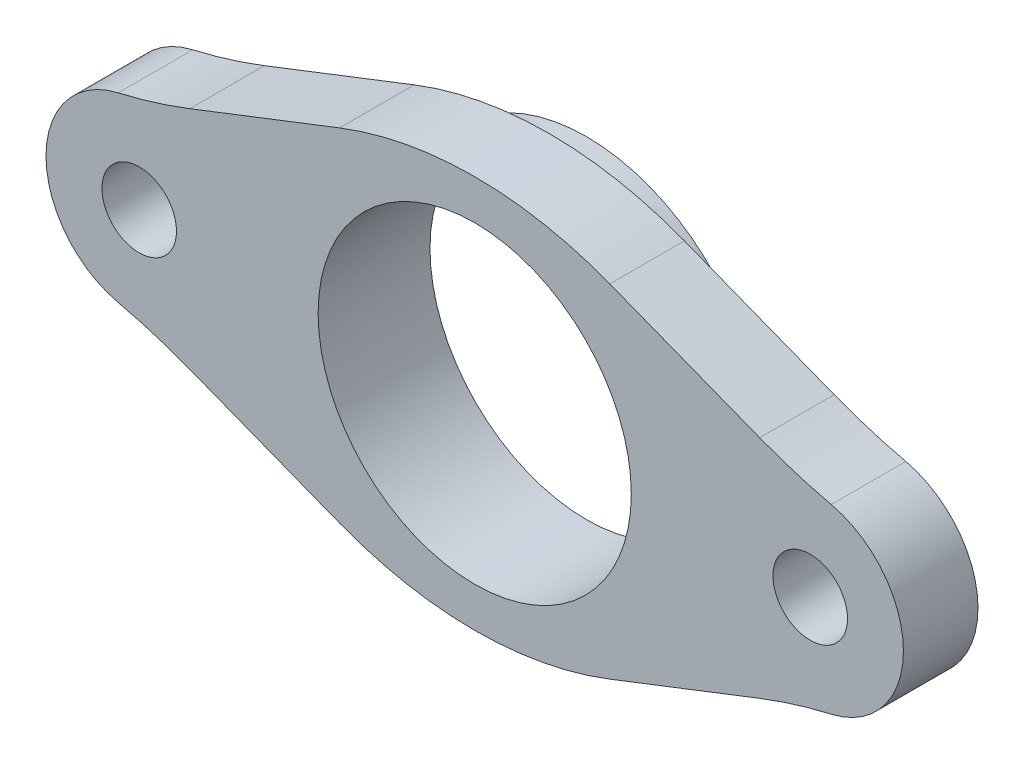
ISO-10303-21;
HEADER;
FILE_DESCRIPTION(('STEP AP214'),'2;1');
FILE_NAME('part.step','',(''),(''),'','','');
FILE_SCHEMA(('AUTOMOTIVE_DESIGN { 1 0 10303 214 1 1 1 1 }'));
ENDSEC;
DATA;
#1=APPLICATION_CONTEXT('core data for automotive mechanical design processes');
#2=APPLICATION_PROTOCOL_DEFINITION('international standard','automotive_design',2000,#1);
#3=PRODUCT_CONTEXT('',#1,'mechanical');
#4=PRODUCT('Part','Part','',(#3));
#5=PRODUCT_RELATED_PRODUCT_CATEGORY('part','',(#4));
#6=PRODUCT_DEFINITION_FORMATION('','',#4);
#7=PRODUCT_DEFINITION_CONTEXT('part definition',#1,'design');
#8=PRODUCT_DEFINITION('design','',#6,#7);
#9=PRODUCT_DEFINITION_SHAPE('','',#8);
#10=(LENGTH_UNIT() NAMED_UNIT(*) SI_UNIT(.MILLI.,.METRE.));
#11=(NAMED_UNIT(*) PLANE_ANGLE_UNIT() SI_UNIT($,.RADIAN.));
#12=(NAMED_UNIT(*) SI_UNIT($,.STERADIAN.) SOLID_ANGLE_UNIT());
#13=UNCERTAINTY_MEASURE_WITH_UNIT(LENGTH_MEASURE(1.E-05),#10,'distance_accuracy_value','');
#14=(GEOMETRIC_REPRESENTATION_CONTEXT(3) GLOBAL_UNCERTAINTY_ASSIGNED_CONTEXT((#13)) GLOBAL_UNIT_ASSIGNED_CONTEXT((#10,
#11,#12)) REPRESENTATION_CONTEXT('',''));
#15=CARTESIAN_POINT('',(0.,0.,0.));
#16=DIRECTION('',(0.,0.,1.));
#17=DIRECTION('',(1.,0.,0.));
#18=AXIS2_PLACEMENT_3D('',#15,#16,#17);
#19=CARTESIAN_POINT('',(-54.3653488949815,215.389389357285,10.));
#20=DIRECTION('',(0.,0.,1.));
#21=DIRECTION('',(1.,0.,0.));
#22=AXIS2_PLACEMENT_3D('',#19,#20,#21);
#23=PLANE('',#22);
#24=CARTESIAN_POINT('',(-54.3653488949814,215.389389357285,10.));
#25=DIRECTION('',(0.,0.,1.));
#26=DIRECTION('',(1.,0.,0.));
#27=AXIS2_PLACEMENT_3D('',#24,#25,#26);
#28=CIRCLE('',#27,5.);
#29=CARTESIAN_POINT('',(-49.3653488949814,215.389389357285,10.));
#30=VERTEX_POINT('',#29);
#31=EDGE_CURVE('E241',#30,#30,#28,.T.);
#32=ORIENTED_EDGE('',*,*,#31,.F.);
#33=EDGE_LOOP('',(#32));
#34=FACE_BOUND('',#33,.T.);
#35=CARTESIAN_POINT('',(-144.365348894981,215.389389357285,10.));
#36=DIRECTION('',(0.,0.,1.));
#37=DIRECTION('',(1.,0.,0.));
#38=AXIS2_PLACEMENT_3D('',#35,#36,#37);
#39=CIRCLE('',#38,12.5);
#40=CARTESIAN_POINT('',(-147.181311053472,227.568073897167,10.));
#41=VERTEX_POINT('',#40);
#42=CARTESIAN_POINT('',(-147.181311053472,203.210704817404,10.));
#43=VERTEX_POINT('',#42);
#44=EDGE_CURVE('E211',#41,#43,#39,.T.);
#45=ORIENTED_EDGE('',*,*,#44,.T.);
#46=CARTESIAN_POINT('',(-162.950699141017,135.010071394067,10.));
#47=DIRECTION('',(0.,0.,1.));
#48=DIRECTION('',(1.,0.,0.));
#49=AXIS2_PLACEMENT_3D('',#46,#47,#48);
#50=CIRCLE('',#49,70.);
#51=CARTESIAN_POINT('',(-137.57917277496,200.250286368088,10.));
#52=VERTEX_POINT('',#51);
#53=EDGE_CURVE('E11',#43,#52,#50,.F.);
#54=ORIENTED_EDGE('',*,*,#53,.T.);
#55=DIRECTION('',(0.932003071057442,-0.362450376657961,0.));
#56=VECTOR('',#55,1.);
#57=CARTESIAN_POINT('',(-99.3659371302731,185.389389357285,10.));
#58=LINE('',#57,#56);
#59=CARTESIAN_POINT('',(-117.488219070191,192.437035571125,10.));
#60=VERTEX_POINT('',#59);
#61=EDGE_CURVE('E210',#52,#60,#58,.T.);
#62=ORIENTED_EDGE('',*,*,#61,.T.);
#63=CARTESIAN_POINT('',(-99.3657002372929,239.037189123997,10.));
#64=DIRECTION('',(0.,0.,1.));
#65=DIRECTION('',(1.,0.,0.));
#66=AXIS2_PLACEMENT_3D('',#63,#64,#65);
#67=CIRCLE('',#66,50.);
#68=CARTESIAN_POINT('',(-81.2435929503765,192.436875525466,10.));
#69=VERTEX_POINT('',#68);
#70=EDGE_CURVE('E163',#60,#69,#67,.T.);
#71=ORIENTED_EDGE('',*,*,#70,.T.);
#72=DIRECTION('',(0.932006271970632,0.362442145738328,0.));
#73=VECTOR('',#72,1.);
#74=CARTESIAN_POINT('',(-54.3653488949815,202.889389357285,10.));
#75=LINE('',#74,#73);
#76=CARTESIAN_POINT('',(-61.1513864356016,200.250409254627,10.));
#77=VERTEX_POINT('',#76);
#78=EDGE_CURVE('E142',#69,#77,#75,.T.);
#79=ORIENTED_EDGE('',*,*,#78,.T.);
#80=CARTESIAN_POINT('',(-35.7804362339186,135.009970216683,10.));
#81=DIRECTION('',(0.,0.,1.));
#82=DIRECTION('',(1.,0.,0.));
#83=AXIS2_PLACEMENT_3D('',#80,#81,#82);
#84=CIRCLE('',#83,70.);
#85=CARTESIAN_POINT('',(-51.5494530372447,203.210689487497,10.));
#86=VERTEX_POINT('',#85);
#87=EDGE_CURVE('E191',#77,#86,#84,.F.);
#88=ORIENTED_EDGE('',*,*,#87,.T.);
#89=CARTESIAN_POINT('',(-54.3653488949815,215.389389357285,10.));
#90=DIRECTION('',(0.,0.,1.));
#91=DIRECTION('',(1.,0.,0.));
#92=AXIS2_PLACEMENT_3D('',#89,#90,#91);
#93=CIRCLE('',#92,12.5);
#94=CARTESIAN_POINT('',(-51.5494530372447,227.568089227074,10.));
#95=VERTEX_POINT('',#94);
#96=EDGE_CURVE('E148',#86,#95,#93,.T.);
#97=ORIENTED_EDGE('',*,*,#96,.T.);
#98=CARTESIAN_POINT('',(-35.7804362339186,295.768808497888,10.));
#99=DIRECTION('',(0.,0.,1.));
#100=DIRECTION('',(1.,0.,0.));
#101=AXIS2_PLACEMENT_3D('',#98,#99,#100);
#102=CIRCLE('',#101,70.);
#103=CARTESIAN_POINT('',(-61.1513864356016,230.528369459944,10.));
#104=VERTEX_POINT('',#103);
#105=EDGE_CURVE('E195',#95,#104,#102,.F.);
#106=ORIENTED_EDGE('',*,*,#105,.T.);
#107=DIRECTION('',(-0.932006271970632,0.362442145738328,0.));
#108=VECTOR('',#107,1.);
#109=CARTESIAN_POINT('',(-54.3653488949815,227.889389357285,10.));
#110=LINE('',#109,#108);
#111=CARTESIAN_POINT('',(-81.2435929503765,238.341903189105,10.));
#112=VERTEX_POINT('',#111);
#113=EDGE_CURVE('E152',#104,#112,#110,.T.);
#114=ORIENTED_EDGE('',*,*,#113,.T.);
#115=CARTESIAN_POINT('',(-99.3657002372929,191.741589590574,10.));
#116=DIRECTION('',(0.,0.,1.));
#117=DIRECTION('',(1.,0.,0.));
#118=AXIS2_PLACEMENT_3D('',#115,#116,#117);
#119=CIRCLE('',#118,50.);
#120=CARTESIAN_POINT('',(-117.488219070191,238.341743143446,10.));
#121=VERTEX_POINT('',#120);
#122=EDGE_CURVE('E161',#112,#121,#119,.T.);
#123=ORIENTED_EDGE('',*,*,#122,.T.);
#124=DIRECTION('',(-0.932003071057441,-0.362450376657962,0.));
#125=VECTOR('',#124,1.);
#126=CARTESIAN_POINT('',(-99.3659371302731,245.389389357285,10.));
#127=LINE('',#126,#125);
#128=CARTESIAN_POINT('',(-137.57917277496,230.528492346483,10.));
#129=VERTEX_POINT('',#128);
#130=EDGE_CURVE('E214',#121,#129,#127,.T.);
#131=ORIENTED_EDGE('',*,*,#130,.T.);
#132=CARTESIAN_POINT('',(-162.950699141018,295.768707320504,10.));
#133=DIRECTION('',(0.,0.,1.));
#134=DIRECTION('',(1.,0.,0.));
#135=AXIS2_PLACEMENT_3D('',#132,#133,#134);
#136=CIRCLE('',#135,70.);
#137=EDGE_CURVE('E199',#129,#41,#136,.F.);
#138=ORIENTED_EDGE('',*,*,#137,.T.);
#139=EDGE_LOOP('',(#45,#54,#62,#71,#79,#88,#97,#106,#114,#123,#131,#138));
#140=FACE_BOUND('',#139,.T.);
#141=CARTESIAN_POINT('',(-144.365348894981,215.389389357285,10.));
#142=DIRECTION('',(0.,0.,1.));
#143=DIRECTION('',(1.,0.,0.));
#144=AXIS2_PLACEMENT_3D('',#141,#142,#143);
#145=CIRCLE('',#144,5.00000000000002);
#146=CARTESIAN_POINT('',(-139.365348894981,215.389389357285,10.));
#147=VERTEX_POINT('',#146);
#148=EDGE_CURVE('E245',#147,#147,#145,.T.);
#149=ORIENTED_EDGE('',*,*,#148,.F.);
#150=EDGE_LOOP('',(#149));
#151=FACE_BOUND('',#150,.T.);
#152=CARTESIAN_POINT('',(-99.3659371302731,215.389389357285,10.));
#153=DIRECTION('',(0.,0.,1.));
#154=DIRECTION('',(1.,0.,0.));
#155=AXIS2_PLACEMENT_3D('',#152,#153,#154);
#156=CIRCLE('',#155,21.);
#157=CARTESIAN_POINT('',(-78.3659371302731,215.389389357285,10.));
#158=VERTEX_POINT('',#157);
#159=EDGE_CURVE('E222',#158,#158,#156,.T.);
#160=ORIENTED_EDGE('',*,*,#159,.F.);
#161=EDGE_LOOP('',(#160));
#162=FACE_BOUND('',#161,.T.);
#163=ADVANCED_FACE('F33',(#34,#140,#151,#162),#23,.T.);
#164=CARTESIAN_POINT('',(-54.3653488949815,215.389389357285,0.));
#165=DIRECTION('',(0.,0.,1.));
#166=DIRECTION('',(1.,0.,0.));
#167=AXIS2_PLACEMENT_3D('',#164,#165,#166);
#168=PLANE('',#167);
#169=CARTESIAN_POINT('',(-99.3659371302731,215.389389357285,0.));
#170=DIRECTION('',(0.,0.,1.));
#171=DIRECTION('',(1.,0.,0.));
#172=AXIS2_PLACEMENT_3D('',#169,#170,#171);
#173=CIRCLE('',#172,23.5);
#174=CARTESIAN_POINT('',(-75.8659371302731,215.389389357285,0.));
#175=VERTEX_POINT('',#174);
#176=EDGE_CURVE('E37',#175,#175,#173,.T.);
#177=ORIENTED_EDGE('',*,*,#176,.T.);
#178=EDGE_LOOP('',(#177));
#179=FACE_BOUND('',#178,.T.);
#180=DIRECTION('',(0.932006271970632,0.362442145738328,0.));
#181=VECTOR('',#180,1.);
#182=CARTESIAN_POINT('',(-54.3653488949815,202.889389357285,0.));
#183=LINE('',#182,#181);
#184=CARTESIAN_POINT('',(-81.2435929503765,192.436875525466,0.));
#185=VERTEX_POINT('',#184);
#186=CARTESIAN_POINT('',(-61.1513864356016,200.250409254627,0.));
#187=VERTEX_POINT('',#186);
#188=EDGE_CURVE('E139',#185,#187,#183,.T.);
#189=ORIENTED_EDGE('',*,*,#188,.F.);
#190=CARTESIAN_POINT('',(-99.3657002372929,239.037189123997,0.));
#191=DIRECTION('',(0.,0.,1.));
#192=DIRECTION('',(1.,0.,0.));
#193=AXIS2_PLACEMENT_3D('',#190,#191,#192);
#194=CIRCLE('',#193,50.);
#195=CARTESIAN_POINT('',(-117.488219070191,192.437035571125,0.));
#196=VERTEX_POINT('',#195);
#197=EDGE_CURVE('E123',#185,#196,#194,.F.);
#198=ORIENTED_EDGE('',*,*,#197,.T.);
#199=DIRECTION('',(0.932003071057442,-0.362450376657961,0.));
#200=VECTOR('',#199,1.);
#201=CARTESIAN_POINT('',(-99.3659371302731,185.389389357285,0.));
#202=LINE('',#201,#200);
#203=CARTESIAN_POINT('',(-137.57917277496,200.250286368088,0.));
#204=VERTEX_POINT('',#203);
#205=EDGE_CURVE('E149',#204,#196,#202,.T.);
#206=ORIENTED_EDGE('',*,*,#205,.F.);
#207=CARTESIAN_POINT('',(-162.950699141017,135.010071394067,0.));
#208=DIRECTION('',(0.,0.,1.));
#209=DIRECTION('',(1.,0.,0.));
#210=AXIS2_PLACEMENT_3D('',#207,#208,#209);
#211=CIRCLE('',#210,70.);
#212=CARTESIAN_POINT('',(-147.181311053472,203.210704817404,0.));
#213=VERTEX_POINT('',#212);
#214=EDGE_CURVE('E42',#204,#213,#211,.T.);
#215=ORIENTED_EDGE('',*,*,#214,.T.);
#216=CARTESIAN_POINT('',(-144.365348894981,215.389389357285,0.));
#217=DIRECTION('',(0.,0.,1.));
#218=DIRECTION('',(1.,0.,0.));
#219=AXIS2_PLACEMENT_3D('',#216,#217,#218);
#220=CIRCLE('',#219,12.5);
#221=CARTESIAN_POINT('',(-147.181311053472,227.568073897167,0.));
#222=VERTEX_POINT('',#221);
#223=EDGE_CURVE('E154',#222,#213,#220,.T.);
#224=ORIENTED_EDGE('',*,*,#223,.F.);
#225=CARTESIAN_POINT('',(-162.950699141018,295.768707320504,0.));
#226=DIRECTION('',(0.,0.,1.));
#227=DIRECTION('',(1.,0.,0.));
#228=AXIS2_PLACEMENT_3D('',#225,#226,#227);
#229=CIRCLE('',#228,70.);
#230=CARTESIAN_POINT('',(-137.57917277496,230.528492346483,0.));
#231=VERTEX_POINT('',#230);
#232=EDGE_CURVE('E197',#222,#231,#229,.T.);
#233=ORIENTED_EDGE('',*,*,#232,.T.);
#234=DIRECTION('',(-0.932003071057441,-0.362450376657962,0.));
#235=VECTOR('',#234,1.);
#236=CARTESIAN_POINT('',(-99.3659371302731,245.389389357285,0.));
#237=LINE('',#236,#235);
#238=CARTESIAN_POINT('',(-117.488219070191,238.341743143446,0.));
#239=VERTEX_POINT('',#238);
#240=EDGE_CURVE('E207',#239,#231,#237,.T.);
#241=ORIENTED_EDGE('',*,*,#240,.F.);
#242=CARTESIAN_POINT('',(-99.3657002372929,191.741589590574,0.));
#243=DIRECTION('',(0.,0.,1.));
#244=DIRECTION('',(1.,0.,0.));
#245=AXIS2_PLACEMENT_3D('',#242,#243,#244);
#246=CIRCLE('',#245,50.);
#247=CARTESIAN_POINT('',(-81.2435929503765,238.341903189105,0.));
#248=VERTEX_POINT('',#247);
#249=EDGE_CURVE('E133',#239,#248,#246,.F.);
#250=ORIENTED_EDGE('',*,*,#249,.T.);
#251=DIRECTION('',(-0.932006271970632,0.362442145738328,0.));
#252=VECTOR('',#251,1.);
#253=CARTESIAN_POINT('',(-54.3653488949815,227.889389357285,0.));
#254=LINE('',#253,#252);
#255=CARTESIAN_POINT('',(-61.1513864356016,230.528369459944,0.));
#256=VERTEX_POINT('',#255);
#257=EDGE_CURVE('E221',#256,#248,#254,.T.);
#258=ORIENTED_EDGE('',*,*,#257,.F.);
#259=CARTESIAN_POINT('',(-35.7804362339186,295.768808497888,0.));
#260=DIRECTION('',(0.,0.,1.));
#261=DIRECTION('',(1.,0.,0.));
#262=AXIS2_PLACEMENT_3D('',#259,#260,#261);
#263=CIRCLE('',#262,70.);
#264=CARTESIAN_POINT('',(-51.5494530372447,227.568089227074,0.));
#265=VERTEX_POINT('',#264);
#266=EDGE_CURVE('E193',#256,#265,#263,.T.);
#267=ORIENTED_EDGE('',*,*,#266,.T.);
#268=CARTESIAN_POINT('',(-54.3653488949815,215.389389357285,0.));
#269=DIRECTION('',(0.,0.,1.));
#270=DIRECTION('',(1.,0.,0.));
#271=AXIS2_PLACEMENT_3D('',#268,#269,#270);
#272=CIRCLE('',#271,12.5);
#273=CARTESIAN_POINT('',(-51.5494530372447,203.210689487497,0.));
#274=VERTEX_POINT('',#273);
#275=EDGE_CURVE('E218',#274,#265,#272,.T.);
#276=ORIENTED_EDGE('',*,*,#275,.F.);
#277=CARTESIAN_POINT('',(-35.7804362339186,135.009970216683,0.));
#278=DIRECTION('',(0.,0.,1.));
#279=DIRECTION('',(1.,0.,0.));
#280=AXIS2_PLACEMENT_3D('',#277,#278,#279);
#281=CIRCLE('',#280,70.);
#282=EDGE_CURVE('E147',#274,#187,#281,.T.);
#283=ORIENTED_EDGE('',*,*,#282,.T.);
#284=EDGE_LOOP('',(#189,#198,#206,#215,#224,#233,#241,#250,#258,#267,#276,#283));
#285=FACE_BOUND('',#284,.T.);
#286=CARTESIAN_POINT('',(-54.3653488949814,215.389389357285,0.));
#287=DIRECTION('',(0.,0.,1.));
#288=DIRECTION('',(1.,0.,0.));
#289=AXIS2_PLACEMENT_3D('',#286,#287,#288);
#290=CIRCLE('',#289,5.);
#291=CARTESIAN_POINT('',(-49.3653488949814,215.389389357285,0.));
#292=VERTEX_POINT('',#291);
#293=EDGE_CURVE('E242',#292,#292,#290,.T.);
#294=ORIENTED_EDGE('',*,*,#293,.T.);
#295=EDGE_LOOP('',(#294));
#296=FACE_BOUND('',#295,.T.);
#297=CARTESIAN_POINT('',(-144.365348894981,215.389389357285,0.));
#298=DIRECTION('',(0.,0.,1.));
#299=DIRECTION('',(1.,0.,0.));
#300=AXIS2_PLACEMENT_3D('',#297,#298,#299);
#301=CIRCLE('',#300,5.00000000000002);
#302=CARTESIAN_POINT('',(-139.365348894981,215.389389357285,0.));
#303=VERTEX_POINT('',#302);
#304=EDGE_CURVE('E248',#303,#303,#301,.T.);
#305=ORIENTED_EDGE('',*,*,#304,.T.);
#306=EDGE_LOOP('',(#305));
#307=FACE_BOUND('',#306,.T.);
#308=ADVANCED_FACE('F144',(#179,#285,#296,#307),#168,.F.);
#309=CARTESIAN_POINT('',(-54.3653488949815,215.389389357285,10.));
#310=DIRECTION('',(0.,0.,-1.));
#311=DIRECTION('',(-1.,0.,0.));
#312=AXIS2_PLACEMENT_3D('',#309,#310,#311);
#313=CYLINDRICAL_SURFACE('',#312,12.5);
#314=ORIENTED_EDGE('',*,*,#96,.F.);
#315=DIRECTION('',(0.,0.,-1.));
#316=VECTOR('',#315,1.);
#317=CARTESIAN_POINT('',(-51.5494530372447,203.210689487497,10.));
#318=LINE('',#317,#316);
#319=EDGE_CURVE('E173',#86,#274,#318,.T.);
#320=ORIENTED_EDGE('',*,*,#319,.T.);
#321=ORIENTED_EDGE('',*,*,#275,.T.);
#322=DIRECTION('',(0.,0.,-1.));
#323=VECTOR('',#322,1.);
#324=CARTESIAN_POINT('',(-51.5494530372447,227.568089227074,10.));
#325=LINE('',#324,#323);
#326=EDGE_CURVE('E171',#265,#95,#325,.F.);
#327=ORIENTED_EDGE('',*,*,#326,.T.);
#328=EDGE_LOOP('',(#314,#320,#321,#327));
#329=FACE_BOUND('',#328,.T.);
#330=ADVANCED_FACE('F285',(#329),#313,.T.);
#331=CARTESIAN_POINT('',(-54.3653488949815,227.889389357285,10.));
#332=DIRECTION('',(-0.362442145738328,-0.932006271970633,0.));
#333=DIRECTION('',(0.932006271970633,-0.362442145738328,0.));
#334=AXIS2_PLACEMENT_3D('',#331,#332,#333);
#335=PLANE('',#334);
#336=ORIENTED_EDGE('',*,*,#113,.F.);
#337=DIRECTION('',(0.,0.,1.));
#338=VECTOR('',#337,1.);
#339=CARTESIAN_POINT('',(-61.1513864356016,230.528369459944,0.));
#340=LINE('',#339,#338);
#341=EDGE_CURVE('E178',#104,#256,#340,.F.);
#342=ORIENTED_EDGE('',*,*,#341,.T.);
#343=ORIENTED_EDGE('',*,*,#257,.T.);
#344=DIRECTION('',(0.,0.,-1.));
#345=VECTOR('',#344,1.);
#346=CARTESIAN_POINT('',(-81.2435929503765,238.341903189105,10.));
#347=LINE('',#346,#345);
#348=EDGE_CURVE('E168',#248,#112,#347,.F.);
#349=ORIENTED_EDGE('',*,*,#348,.T.);
#350=EDGE_LOOP('',(#336,#342,#343,#349));
#351=FACE_BOUND('',#350,.T.);
#352=ADVANCED_FACE('F296',(#351),#335,.F.);
#353=CARTESIAN_POINT('',(-99.3659371302731,245.389389357285,10.));
#354=DIRECTION('',(0.362450376657962,-0.932003071057441,0.));
#355=DIRECTION('',(0.932003071057441,0.362450376657962,0.));
#356=AXIS2_PLACEMENT_3D('',#353,#354,#355);
#357=PLANE('',#356);
#358=ORIENTED_EDGE('',*,*,#240,.T.);
#359=DIRECTION('',(0.,0.,1.));
#360=VECTOR('',#359,1.);
#361=CARTESIAN_POINT('',(-137.57917277496,230.528492346483,10.));
#362=LINE('',#361,#360);
#363=EDGE_CURVE('E186',#231,#129,#362,.T.);
#364=ORIENTED_EDGE('',*,*,#363,.T.);
#365=ORIENTED_EDGE('',*,*,#130,.F.);
#366=DIRECTION('',(0.,0.,-1.));
#367=VECTOR('',#366,1.);
#368=CARTESIAN_POINT('',(-117.488219070191,238.341743143446,10.));
#369=LINE('',#368,#367);
#370=EDGE_CURVE('E165',#121,#239,#369,.T.);
#371=ORIENTED_EDGE('',*,*,#370,.T.);
#372=EDGE_LOOP('',(#358,#364,#365,#371));
#373=FACE_BOUND('',#372,.T.);
#374=ADVANCED_FACE('F228',(#373),#357,.F.);
#375=CARTESIAN_POINT('',(-144.365348894981,215.389389357285,10.));
#376=DIRECTION('',(0.,0.,-1.));
#377=DIRECTION('',(-1.,0.,0.));
#378=AXIS2_PLACEMENT_3D('',#375,#376,#377);
#379=CYLINDRICAL_SURFACE('',#378,12.5);
#380=ORIENTED_EDGE('',*,*,#44,.F.);
#381=DIRECTION('',(0.,0.,-1.));
#382=VECTOR('',#381,1.);
#383=CARTESIAN_POINT('',(-147.181311053472,227.568073897167,10.));
#384=LINE('',#383,#382);
#385=EDGE_CURVE('E183',#41,#222,#384,.T.);
#386=ORIENTED_EDGE('',*,*,#385,.T.);
#387=ORIENTED_EDGE('',*,*,#223,.T.);
#388=DIRECTION('',(0.,0.,-1.));
#389=VECTOR('',#388,1.);
#390=CARTESIAN_POINT('',(-147.181311053472,203.210704817404,10.));
#391=LINE('',#390,#389);
#392=EDGE_CURVE('E181',#213,#43,#391,.F.);
#393=ORIENTED_EDGE('',*,*,#392,.T.);
#394=EDGE_LOOP('',(#380,#386,#387,#393));
#395=FACE_BOUND('',#394,.T.);
#396=ADVANCED_FACE('F205',(#395),#379,.T.);
#397=CARTESIAN_POINT('',(-99.3659371302731,185.389389357285,10.));
#398=DIRECTION('',(0.362450376657961,0.932003071057442,0.));
#399=DIRECTION('',(-0.932003071057442,0.362450376657961,0.));
#400=AXIS2_PLACEMENT_3D('',#397,#398,#399);
#401=PLANE('',#400);
#402=ORIENTED_EDGE('',*,*,#61,.F.);
#403=DIRECTION('',(0.,0.,1.));
#404=VECTOR('',#403,1.);
#405=CARTESIAN_POINT('',(-137.57917277496,200.250286368088,0.));
#406=LINE('',#405,#404);
#407=EDGE_CURVE('E188',#52,#204,#406,.F.);
#408=ORIENTED_EDGE('',*,*,#407,.T.);
#409=ORIENTED_EDGE('',*,*,#205,.T.);
#410=DIRECTION('',(0.,0.,-1.));
#411=VECTOR('',#410,1.);
#412=CARTESIAN_POINT('',(-117.488219070191,192.437035571125,10.));
#413=LINE('',#412,#411);
#414=EDGE_CURVE('E129',#196,#60,#413,.F.);
#415=ORIENTED_EDGE('',*,*,#414,.T.);
#416=EDGE_LOOP('',(#402,#408,#409,#415));
#417=FACE_BOUND('',#416,.T.);
#418=ADVANCED_FACE('F209',(#417),#401,.F.);
#419=CARTESIAN_POINT('',(-54.3653488949815,202.889389357285,10.));
#420=DIRECTION('',(-0.362442145738328,0.932006271970633,0.));
#421=DIRECTION('',(-0.932006271970633,-0.362442145738328,0.));
#422=AXIS2_PLACEMENT_3D('',#419,#420,#421);
#423=PLANE('',#422);
#424=ORIENTED_EDGE('',*,*,#188,.T.);
#425=DIRECTION('',(0.,0.,1.));
#426=VECTOR('',#425,1.);
#427=CARTESIAN_POINT('',(-61.1513864356016,200.250409254627,10.));
#428=LINE('',#427,#426);
#429=EDGE_CURVE('E176',#187,#77,#428,.T.);
#430=ORIENTED_EDGE('',*,*,#429,.T.);
#431=ORIENTED_EDGE('',*,*,#78,.F.);
#432=DIRECTION('',(0.,0.,-1.));
#433=VECTOR('',#432,1.);
#434=CARTESIAN_POINT('',(-81.2435929503765,192.436875525466,10.));
#435=LINE('',#434,#433);
#436=EDGE_CURVE('E127',#69,#185,#435,.T.);
#437=ORIENTED_EDGE('',*,*,#436,.T.);
#438=EDGE_LOOP('',(#424,#430,#431,#437));
#439=FACE_BOUND('',#438,.T.);
#440=ADVANCED_FACE('F138',(#439),#423,.F.);
#441=CARTESIAN_POINT('',(-99.3659371302731,215.389389357285,10.));
#442=DIRECTION('',(0.,0.,-1.));
#443=DIRECTION('',(-1.,0.,0.));
#444=AXIS2_PLACEMENT_3D('',#441,#442,#443);
#445=CYLINDRICAL_SURFACE('',#444,21.);
#446=ORIENTED_EDGE('',*,*,#159,.T.);
#447=EDGE_LOOP('',(#446));
#448=FACE_BOUND('',#447,.T.);
#449=CARTESIAN_POINT('',(-99.3659371302731,215.389389357285,-5.));
#450=DIRECTION('',(0.,0.,1.));
#451=DIRECTION('',(1.,0.,0.));
#452=AXIS2_PLACEMENT_3D('',#449,#450,#451);
#453=CIRCLE('',#452,21.);
#454=CARTESIAN_POINT('',(-78.3659371302731,215.389389357285,-5.));
#455=VERTEX_POINT('',#454);
#456=EDGE_CURVE('E256',#455,#455,#453,.T.);
#457=ORIENTED_EDGE('',*,*,#456,.F.);
#458=EDGE_LOOP('',(#457));
#459=FACE_BOUND('',#458,.T.);
#460=ADVANCED_FACE('F263',(#448,#459),#445,.F.);
#461=CARTESIAN_POINT('',(-54.3653488949814,215.389389357285,10.));
#462=DIRECTION('',(0.,0.,-1.));
#463=DIRECTION('',(-1.,0.,0.));
#464=AXIS2_PLACEMENT_3D('',#461,#462,#463);
#465=CYLINDRICAL_SURFACE('',#464,5.);
#466=ORIENTED_EDGE('',*,*,#31,.T.);
#467=EDGE_LOOP('',(#466));
#468=FACE_BOUND('',#467,.T.);
#469=ORIENTED_EDGE('',*,*,#293,.F.);
#470=EDGE_LOOP('',(#469));
#471=FACE_BOUND('',#470,.T.);
#472=ADVANCED_FACE('F265',(#468,#471),#465,.F.);
#473=CARTESIAN_POINT('',(-144.365348894981,215.389389357285,10.));
#474=DIRECTION('',(0.,0.,-1.));
#475=DIRECTION('',(-1.,0.,0.));
#476=AXIS2_PLACEMENT_3D('',#473,#474,#475);
#477=CYLINDRICAL_SURFACE('',#476,5.00000000000002);
#478=ORIENTED_EDGE('',*,*,#148,.T.);
#479=EDGE_LOOP('',(#478));
#480=FACE_BOUND('',#479,.T.);
#481=ORIENTED_EDGE('',*,*,#304,.F.);
#482=EDGE_LOOP('',(#481));
#483=FACE_BOUND('',#482,.T.);
#484=ADVANCED_FACE('F273',(#480,#483),#477,.F.);
#485=CARTESIAN_POINT('',(-99.3657002372929,239.037189123997,10.));
#486=DIRECTION('',(0.,0.,-1.));
#487=DIRECTION('',(-1.,0.,0.));
#488=AXIS2_PLACEMENT_3D('',#485,#486,#487);
#489=CYLINDRICAL_SURFACE('',#488,50.);
#490=ORIENTED_EDGE('',*,*,#70,.F.);
#491=ORIENTED_EDGE('',*,*,#414,.F.);
#492=ORIENTED_EDGE('',*,*,#197,.F.);
#493=ORIENTED_EDGE('',*,*,#436,.F.);
#494=EDGE_LOOP('',(#490,#491,#492,#493));
#495=FACE_BOUND('',#494,.T.);
#496=ADVANCED_FACE('F126',(#495),#489,.T.);
#497=CARTESIAN_POINT('',(-99.3657002372929,191.741589590574,10.));
#498=DIRECTION('',(0.,0.,-1.));
#499=DIRECTION('',(-1.,0.,0.));
#500=AXIS2_PLACEMENT_3D('',#497,#498,#499);
#501=CYLINDRICAL_SURFACE('',#500,50.);
#502=ORIENTED_EDGE('',*,*,#122,.F.);
#503=ORIENTED_EDGE('',*,*,#348,.F.);
#504=ORIENTED_EDGE('',*,*,#249,.F.);
#505=ORIENTED_EDGE('',*,*,#370,.F.);
#506=EDGE_LOOP('',(#502,#503,#504,#505));
#507=FACE_BOUND('',#506,.T.);
#508=ADVANCED_FACE('F305',(#507),#501,.T.);
#509=CARTESIAN_POINT('',(-35.7804362339186,135.009970216683,10.));
#510=DIRECTION('',(0.,0.,-1.));
#511=DIRECTION('',(-1.,0.,0.));
#512=AXIS2_PLACEMENT_3D('',#509,#510,#511);
#513=CYLINDRICAL_SURFACE('',#512,70.);
#514=ORIENTED_EDGE('',*,*,#87,.F.);
#515=ORIENTED_EDGE('',*,*,#429,.F.);
#516=ORIENTED_EDGE('',*,*,#282,.F.);
#517=ORIENTED_EDGE('',*,*,#319,.F.);
#518=EDGE_LOOP('',(#514,#515,#516,#517));
#519=FACE_BOUND('',#518,.T.);
#520=ADVANCED_FACE('F308',(#519),#513,.F.);
#521=CARTESIAN_POINT('',(-35.7804362339186,295.768808497888,10.));
#522=DIRECTION('',(0.,0.,-1.));
#523=DIRECTION('',(-1.,0.,0.));
#524=AXIS2_PLACEMENT_3D('',#521,#522,#523);
#525=CYLINDRICAL_SURFACE('',#524,70.);
#526=ORIENTED_EDGE('',*,*,#105,.F.);
#527=ORIENTED_EDGE('',*,*,#326,.F.);
#528=ORIENTED_EDGE('',*,*,#266,.F.);
#529=ORIENTED_EDGE('',*,*,#341,.F.);
#530=EDGE_LOOP('',(#526,#527,#528,#529));
#531=FACE_BOUND('',#530,.T.);
#532=ADVANCED_FACE('F312',(#531),#525,.F.);
#533=CARTESIAN_POINT('',(-162.950699141018,295.768707320504,10.));
#534=DIRECTION('',(0.,0.,-1.));
#535=DIRECTION('',(-1.,0.,0.));
#536=AXIS2_PLACEMENT_3D('',#533,#534,#535);
#537=CYLINDRICAL_SURFACE('',#536,70.);
#538=ORIENTED_EDGE('',*,*,#137,.F.);
#539=ORIENTED_EDGE('',*,*,#363,.F.);
#540=ORIENTED_EDGE('',*,*,#232,.F.);
#541=ORIENTED_EDGE('',*,*,#385,.F.);
#542=EDGE_LOOP('',(#538,#539,#540,#541));
#543=FACE_BOUND('',#542,.T.);
#544=ADVANCED_FACE('F234',(#543),#537,.F.);
#545=CARTESIAN_POINT('',(-162.950699141017,135.010071394067,10.));
#546=DIRECTION('',(0.,0.,-1.));
#547=DIRECTION('',(-1.,0.,0.));
#548=AXIS2_PLACEMENT_3D('',#545,#546,#547);
#549=CYLINDRICAL_SURFACE('',#548,70.);
#550=ORIENTED_EDGE('',*,*,#53,.F.);
#551=ORIENTED_EDGE('',*,*,#392,.F.);
#552=ORIENTED_EDGE('',*,*,#214,.F.);
#553=ORIENTED_EDGE('',*,*,#407,.F.);
#554=EDGE_LOOP('',(#550,#551,#552,#553));
#555=FACE_BOUND('',#554,.T.);
#556=ADVANCED_FACE('F35',(#555),#549,.F.);
#557=CARTESIAN_POINT('',(-99.3659371302731,215.389389357285,-5.));
#558=DIRECTION('',(0.,0.,1.));
#559=DIRECTION('',(1.,0.,0.));
#560=AXIS2_PLACEMENT_3D('',#557,#558,#559);
#561=CYLINDRICAL_SURFACE('',#560,23.5);
#562=CARTESIAN_POINT('',(-99.3659371302731,215.389389357285,-5.));
#563=DIRECTION('',(0.,0.,1.));
#564=DIRECTION('',(1.,0.,0.));
#565=AXIS2_PLACEMENT_3D('',#562,#563,#564);
#566=CIRCLE('',#565,23.5);
#567=CARTESIAN_POINT('',(-75.8659371302731,215.389389357285,-5.));
#568=VERTEX_POINT('',#567);
#569=EDGE_CURVE('E253',#568,#568,#566,.T.);
#570=ORIENTED_EDGE('',*,*,#569,.T.);
#571=EDGE_LOOP('',(#570));
#572=FACE_BOUND('',#571,.T.);
#573=ORIENTED_EDGE('',*,*,#176,.F.);
#574=EDGE_LOOP('',(#573));
#575=FACE_BOUND('',#574,.T.);
#576=ADVANCED_FACE('F319',(#572,#575),#561,.T.);
#577=CARTESIAN_POINT('',(-99.3659371302731,215.389389357285,-5.));
#578=DIRECTION('',(0.,0.,1.));
#579=DIRECTION('',(1.,0.,0.));
#580=AXIS2_PLACEMENT_3D('',#577,#578,#579);
#581=PLANE('',#580);
#582=ORIENTED_EDGE('',*,*,#456,.T.);
#583=EDGE_LOOP('',(#582));
#584=FACE_BOUND('',#583,.T.);
#585=ORIENTED_EDGE('',*,*,#569,.F.);
#586=EDGE_LOOP('',(#585));
#587=FACE_BOUND('',#586,.T.);
#588=ADVANCED_FACE('F260',(#584,#587),#581,.F.);
#589=CLOSED_SHELL('',(#163,#308,#330,#352,#374,#396,#418,#440,#460,#472,#484,#496,#508,#520,
#532,#544,#556,#576,#588));
#590=MANIFOLD_SOLID_BREP('B2',#589);
#591=ADVANCED_BREP_SHAPE_REPRESENTATION('',(#18,#590),#14);
#592=SHAPE_DEFINITION_REPRESENTATION(#9,#591);
ENDSEC;
END-ISO-10303-21;
